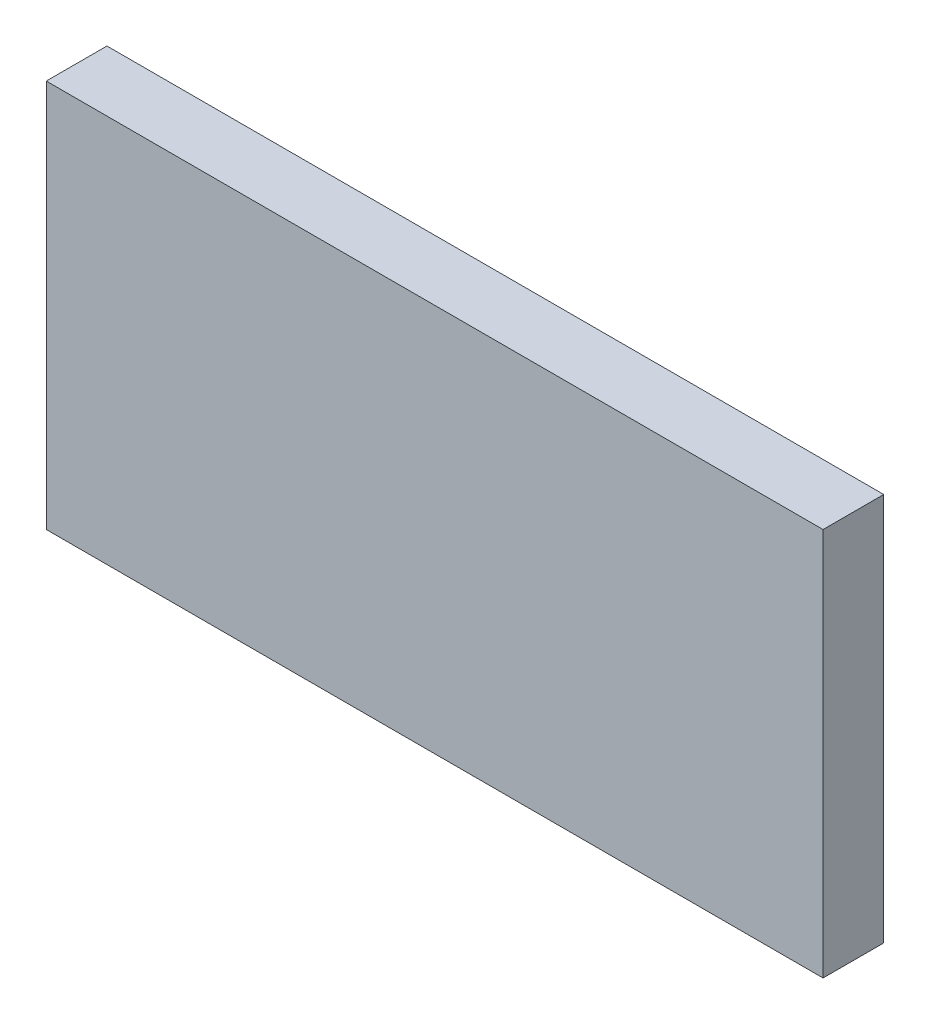
ISO-10303-21;
HEADER;
FILE_DESCRIPTION(('STEP AP214'),'2;1');
FILE_NAME('part.step','',(''),(''),'','','');
FILE_SCHEMA(('AUTOMOTIVE_DESIGN { 1 0 10303 214 1 1 1 1 }'));
ENDSEC;
DATA;
#1=APPLICATION_CONTEXT('core data for automotive mechanical design processes');
#2=APPLICATION_PROTOCOL_DEFINITION('international standard','automotive_design',2000,#1);
#3=PRODUCT_CONTEXT('',#1,'mechanical');
#4=PRODUCT('Part','Part','',(#3));
#5=PRODUCT_RELATED_PRODUCT_CATEGORY('part','',(#4));
#6=PRODUCT_DEFINITION_FORMATION('','',#4);
#7=PRODUCT_DEFINITION_CONTEXT('part definition',#1,'design');
#8=PRODUCT_DEFINITION('design','',#6,#7);
#9=PRODUCT_DEFINITION_SHAPE('','',#8);
#10=(LENGTH_UNIT() NAMED_UNIT(*) SI_UNIT(.MILLI.,.METRE.));
#11=(NAMED_UNIT(*) PLANE_ANGLE_UNIT() SI_UNIT($,.RADIAN.));
#12=(NAMED_UNIT(*) SI_UNIT($,.STERADIAN.) SOLID_ANGLE_UNIT());
#13=UNCERTAINTY_MEASURE_WITH_UNIT(LENGTH_MEASURE(1.E-05),#10,'distance_accuracy_value','');
#14=(GEOMETRIC_REPRESENTATION_CONTEXT(3) GLOBAL_UNCERTAINTY_ASSIGNED_CONTEXT((#13)) GLOBAL_UNIT_ASSIGNED_CONTEXT((#10,
#11,#12)) REPRESENTATION_CONTEXT('',''));
#15=CARTESIAN_POINT('',(0.,0.,0.));
#16=DIRECTION('',(0.,0.,1.));
#17=DIRECTION('',(1.,0.,0.));
#18=AXIS2_PLACEMENT_3D('',#15,#16,#17);
#19=CARTESIAN_POINT('',(32.,16.,5.));
#20=DIRECTION('',(-1.,0.,0.));
#21=DIRECTION('',(0.,0.,1.));
#22=AXIS2_PLACEMENT_3D('',#19,#20,#21);
#23=PLANE('',#22);
#24=DIRECTION('',(0.,1.,0.));
#25=VECTOR('',#24,1.);
#26=CARTESIAN_POINT('',(32.,16.,0.));
#27=LINE('',#26,#25);
#28=CARTESIAN_POINT('',(32.,-16.,0.));
#29=VERTEX_POINT('',#28);
#30=CARTESIAN_POINT('',(32.,16.,0.));
#31=VERTEX_POINT('',#30);
#32=EDGE_CURVE('E107',#29,#31,#27,.T.);
#33=ORIENTED_EDGE('',*,*,#32,.T.);
#34=DIRECTION('',(0.,0.,-1.));
#35=VECTOR('',#34,1.);
#36=CARTESIAN_POINT('',(32.,16.,5.));
#37=LINE('',#36,#35);
#38=CARTESIAN_POINT('',(32.,16.,5.));
#39=VERTEX_POINT('',#38);
#40=EDGE_CURVE('E11',#39,#31,#37,.T.);
#41=ORIENTED_EDGE('',*,*,#40,.F.);
#42=DIRECTION('',(0.,1.,0.));
#43=VECTOR('',#42,1.);
#44=CARTESIAN_POINT('',(32.,16.,5.));
#45=LINE('',#44,#43);
#46=CARTESIAN_POINT('',(32.,-16.,5.));
#47=VERTEX_POINT('',#46);
#48=EDGE_CURVE('E91',#47,#39,#45,.T.);
#49=ORIENTED_EDGE('',*,*,#48,.F.);
#50=DIRECTION('',(0.,0.,-1.));
#51=VECTOR('',#50,1.);
#52=CARTESIAN_POINT('',(32.,-16.,5.));
#53=LINE('',#52,#51);
#54=EDGE_CURVE('E103',#47,#29,#53,.T.);
#55=ORIENTED_EDGE('',*,*,#54,.T.);
#56=EDGE_LOOP('',(#33,#41,#49,#55));
#57=FACE_BOUND('',#56,.T.);
#58=ADVANCED_FACE('F39',(#57),#23,.F.);
#59=CARTESIAN_POINT('',(-32.,16.,5.));
#60=DIRECTION('',(0.,-1.,0.));
#61=DIRECTION('',(0.,0.,-1.));
#62=AXIS2_PLACEMENT_3D('',#59,#60,#61);
#63=PLANE('',#62);
#64=DIRECTION('',(-1.,0.,0.));
#65=VECTOR('',#64,1.);
#66=CARTESIAN_POINT('',(-32.,16.,0.));
#67=LINE('',#66,#65);
#68=CARTESIAN_POINT('',(-32.,16.,0.));
#69=VERTEX_POINT('',#68);
#70=EDGE_CURVE('E96',#31,#69,#67,.T.);
#71=ORIENTED_EDGE('',*,*,#70,.T.);
#72=DIRECTION('',(0.,0.,-1.));
#73=VECTOR('',#72,1.);
#74=CARTESIAN_POINT('',(-32.,16.,5.));
#75=LINE('',#74,#73);
#76=CARTESIAN_POINT('',(-32.,16.,5.));
#77=VERTEX_POINT('',#76);
#78=EDGE_CURVE('E48',#77,#69,#75,.T.);
#79=ORIENTED_EDGE('',*,*,#78,.F.);
#80=DIRECTION('',(-1.,0.,0.));
#81=VECTOR('',#80,1.);
#82=CARTESIAN_POINT('',(-32.,16.,5.));
#83=LINE('',#82,#81);
#84=EDGE_CURVE('E86',#39,#77,#83,.T.);
#85=ORIENTED_EDGE('',*,*,#84,.F.);
#86=ORIENTED_EDGE('',*,*,#40,.T.);
#87=EDGE_LOOP('',(#71,#79,#85,#86));
#88=FACE_BOUND('',#87,.T.);
#89=ADVANCED_FACE('F95',(#88),#63,.F.);
#90=CARTESIAN_POINT('',(-32.,16.,5.));
#91=DIRECTION('',(1.,0.,0.));
#92=DIRECTION('',(0.,1.,0.));
#93=AXIS2_PLACEMENT_3D('',#90,#91,#92);
#94=PLANE('',#93);
#95=DIRECTION('',(0.,-1.,0.));
#96=VECTOR('',#95,1.);
#97=CARTESIAN_POINT('',(-32.,16.,0.));
#98=LINE('',#97,#96);
#99=CARTESIAN_POINT('',(-32.,-16.,0.));
#100=VERTEX_POINT('',#99);
#101=EDGE_CURVE('E73',#69,#100,#98,.T.);
#102=ORIENTED_EDGE('',*,*,#101,.T.);
#103=DIRECTION('',(0.,0.,-1.));
#104=VECTOR('',#103,1.);
#105=CARTESIAN_POINT('',(-32.,-16.,5.));
#106=LINE('',#105,#104);
#107=CARTESIAN_POINT('',(-32.,-16.,5.));
#108=VERTEX_POINT('',#107);
#109=EDGE_CURVE('E98',#108,#100,#106,.T.);
#110=ORIENTED_EDGE('',*,*,#109,.F.);
#111=DIRECTION('',(0.,-1.,0.));
#112=VECTOR('',#111,1.);
#113=CARTESIAN_POINT('',(-32.,16.,5.));
#114=LINE('',#113,#112);
#115=EDGE_CURVE('E89',#77,#108,#114,.T.);
#116=ORIENTED_EDGE('',*,*,#115,.F.);
#117=ORIENTED_EDGE('',*,*,#78,.T.);
#118=EDGE_LOOP('',(#102,#110,#116,#117));
#119=FACE_BOUND('',#118,.T.);
#120=ADVANCED_FACE('F99',(#119),#94,.F.);
#121=CARTESIAN_POINT('',(-32.,-16.,5.));
#122=DIRECTION('',(0.,1.,0.));
#123=DIRECTION('',(0.,0.,1.));
#124=AXIS2_PLACEMENT_3D('',#121,#122,#123);
#125=PLANE('',#124);
#126=DIRECTION('',(1.,0.,0.));
#127=VECTOR('',#126,1.);
#128=CARTESIAN_POINT('',(-32.,-16.,0.));
#129=LINE('',#128,#127);
#130=EDGE_CURVE('E79',#100,#29,#129,.T.);
#131=ORIENTED_EDGE('',*,*,#130,.T.);
#132=ORIENTED_EDGE('',*,*,#54,.F.);
#133=DIRECTION('',(1.,0.,0.));
#134=VECTOR('',#133,1.);
#135=CARTESIAN_POINT('',(-32.,-16.,5.));
#136=LINE('',#135,#134);
#137=EDGE_CURVE('E56',#108,#47,#136,.T.);
#138=ORIENTED_EDGE('',*,*,#137,.F.);
#139=ORIENTED_EDGE('',*,*,#109,.T.);
#140=EDGE_LOOP('',(#131,#132,#138,#139));
#141=FACE_BOUND('',#140,.T.);
#142=ADVANCED_FACE('F120',(#141),#125,.F.);
#143=CARTESIAN_POINT('',(0.,0.,5.));
#144=DIRECTION('',(0.,0.,1.));
#145=DIRECTION('',(1.,0.,0.));
#146=AXIS2_PLACEMENT_3D('',#143,#144,#145);
#147=PLANE('',#146);
#148=ORIENTED_EDGE('',*,*,#48,.T.);
#149=ORIENTED_EDGE('',*,*,#84,.T.);
#150=ORIENTED_EDGE('',*,*,#115,.T.);
#151=ORIENTED_EDGE('',*,*,#137,.T.);
#152=EDGE_LOOP('',(#148,#149,#150,#151));
#153=FACE_BOUND('',#152,.T.);
#154=ADVANCED_FACE('F87',(#153),#147,.T.);
#155=CARTESIAN_POINT('',(0.,0.,0.));
#156=DIRECTION('',(0.,0.,1.));
#157=DIRECTION('',(1.,0.,0.));
#158=AXIS2_PLACEMENT_3D('',#155,#156,#157);
#159=PLANE('',#158);
#160=ORIENTED_EDGE('',*,*,#32,.F.);
#161=ORIENTED_EDGE('',*,*,#130,.F.);
#162=ORIENTED_EDGE('',*,*,#101,.F.);
#163=ORIENTED_EDGE('',*,*,#70,.F.);
#164=EDGE_LOOP('',(#160,#161,#162,#163));
#165=FACE_BOUND('',#164,.T.);
#166=ADVANCED_FACE('F123',(#165),#159,.F.);
#167=CLOSED_SHELL('',(#58,#89,#120,#142,#154,#166));
#168=MANIFOLD_SOLID_BREP('B2',#167);
#169=ADVANCED_BREP_SHAPE_REPRESENTATION('',(#18,#168),#14);
#170=SHAPE_DEFINITION_REPRESENTATION(#9,#169);
ENDSEC;
END-ISO-10303-21;
